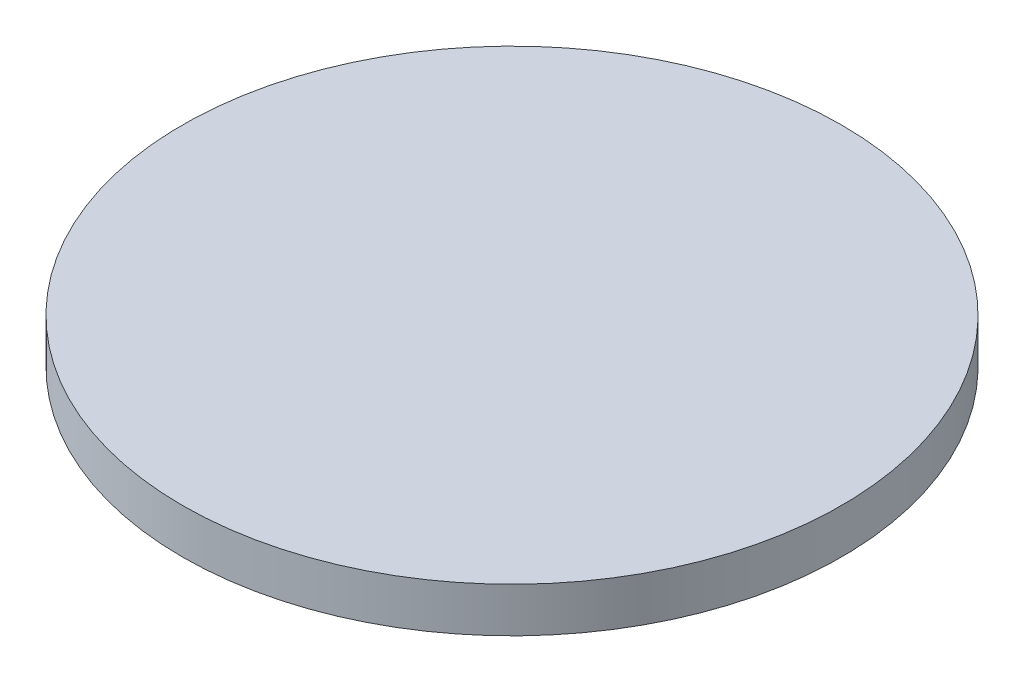
ISO-10303-21;
HEADER;
FILE_DESCRIPTION(('STEP AP214'),'2;1');
FILE_NAME('part.step','',(''),(''),'','','');
FILE_SCHEMA(('AUTOMOTIVE_DESIGN { 1 0 10303 214 1 1 1 1 }'));
ENDSEC;
DATA;
#1=APPLICATION_CONTEXT('core data for automotive mechanical design processes');
#2=APPLICATION_PROTOCOL_DEFINITION('international standard','automotive_design',2000,#1);
#3=PRODUCT_CONTEXT('',#1,'mechanical');
#4=PRODUCT('Part','Part','',(#3));
#5=PRODUCT_RELATED_PRODUCT_CATEGORY('part','',(#4));
#6=PRODUCT_DEFINITION_FORMATION('','',#4);
#7=PRODUCT_DEFINITION_CONTEXT('part definition',#1,'design');
#8=PRODUCT_DEFINITION('design','',#6,#7);
#9=PRODUCT_DEFINITION_SHAPE('','',#8);
#10=(LENGTH_UNIT() NAMED_UNIT(*) SI_UNIT(.MILLI.,.METRE.));
#11=(NAMED_UNIT(*) PLANE_ANGLE_UNIT() SI_UNIT($,.RADIAN.));
#12=(NAMED_UNIT(*) SI_UNIT($,.STERADIAN.) SOLID_ANGLE_UNIT());
#13=UNCERTAINTY_MEASURE_WITH_UNIT(LENGTH_MEASURE(1.E-05),#10,'distance_accuracy_value','');
#14=(GEOMETRIC_REPRESENTATION_CONTEXT(3) GLOBAL_UNCERTAINTY_ASSIGNED_CONTEXT((#13)) GLOBAL_UNIT_ASSIGNED_CONTEXT((#10,
#11,#12)) REPRESENTATION_CONTEXT('',''));
#15=CARTESIAN_POINT('',(0.,0.,0.));
#16=DIRECTION('',(0.,0.,1.));
#17=DIRECTION('',(1.,0.,0.));
#18=AXIS2_PLACEMENT_3D('',#15,#16,#17);
#19=CARTESIAN_POINT('',(63.8175,-3.175,-63.8175));
#20=DIRECTION('',(0.,1.,0.));
#21=DIRECTION('',(0.,0.,1.));
#22=AXIS2_PLACEMENT_3D('',#19,#20,#21);
#23=CYLINDRICAL_SURFACE('',#22,93.6625);
#24=CARTESIAN_POINT('',(63.8175,-3.175,-63.8175));
#25=DIRECTION('',(0.,1.,0.));
#26=DIRECTION('',(0.,0.,1.));
#27=AXIS2_PLACEMENT_3D('',#24,#25,#26);
#28=CIRCLE('',#27,93.6625);
#29=CARTESIAN_POINT('',(63.8175,-3.175,29.845));
#30=VERTEX_POINT('',#29);
#31=EDGE_CURVE('E10',#30,#30,#28,.T.);
#32=ORIENTED_EDGE('',*,*,#31,.T.);
#33=EDGE_LOOP('',(#32));
#34=FACE_BOUND('',#33,.T.);
#35=CARTESIAN_POINT('',(63.8175,9.525,-63.8175));
#36=DIRECTION('',(0.,1.,0.));
#37=DIRECTION('',(0.,0.,1.));
#38=AXIS2_PLACEMENT_3D('',#35,#36,#37);
#39=CIRCLE('',#38,93.6625);
#40=CARTESIAN_POINT('',(63.8175,9.525,29.845));
#41=VERTEX_POINT('',#40);
#42=EDGE_CURVE('E45',#41,#41,#39,.T.);
#43=ORIENTED_EDGE('',*,*,#42,.F.);
#44=EDGE_LOOP('',(#43));
#45=FACE_BOUND('',#44,.T.);
#46=ADVANCED_FACE('F41',(#34,#45),#23,.T.);
#47=CARTESIAN_POINT('',(63.8175,-3.175,-63.8175));
#48=DIRECTION('',(0.,1.,0.));
#49=DIRECTION('',(0.,0.,1.));
#50=AXIS2_PLACEMENT_3D('',#47,#48,#49);
#51=PLANE('',#50);
#52=ORIENTED_EDGE('',*,*,#31,.F.);
#53=EDGE_LOOP('',(#52));
#54=FACE_BOUND('',#53,.T.);
#55=ADVANCED_FACE('F56',(#54),#51,.F.);
#56=CARTESIAN_POINT('',(0.,9.525,0.));
#57=DIRECTION('',(0.,-1.,0.));
#58=DIRECTION('',(0.,0.,-1.));
#59=AXIS2_PLACEMENT_3D('',#56,#57,#58);
#60=PLANE('',#59);
#61=ORIENTED_EDGE('',*,*,#42,.T.);
#62=EDGE_LOOP('',(#61));
#63=FACE_BOUND('',#62,.T.);
#64=ADVANCED_FACE('F43',(#63),#60,.F.);
#65=CLOSED_SHELL('',(#46,#55,#64));
#66=MANIFOLD_SOLID_BREP('B2',#65);
#67=ADVANCED_BREP_SHAPE_REPRESENTATION('',(#18,#66),#14);
#68=SHAPE_DEFINITION_REPRESENTATION(#9,#67);
ENDSEC;
END-ISO-10303-21;
